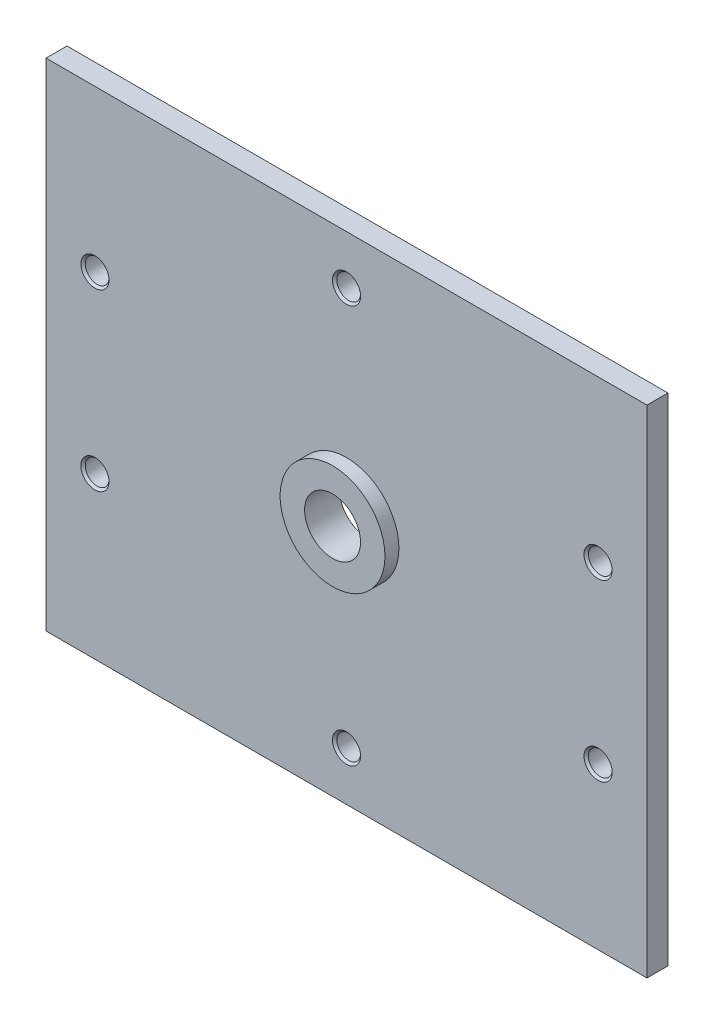
ISO-10303-21;
HEADER;
FILE_DESCRIPTION(('STEP AP214'),'2;1');
FILE_NAME('part.step','',(''),(''),'','','');
FILE_SCHEMA(('AUTOMOTIVE_DESIGN { 1 0 10303 214 1 1 1 1 }'));
ENDSEC;
DATA;
#1=APPLICATION_CONTEXT('core data for automotive mechanical design processes');
#2=APPLICATION_PROTOCOL_DEFINITION('international standard','automotive_design',2000,#1);
#3=PRODUCT_CONTEXT('',#1,'mechanical');
#4=PRODUCT('Part','Part','',(#3));
#5=PRODUCT_RELATED_PRODUCT_CATEGORY('part','',(#4));
#6=PRODUCT_DEFINITION_FORMATION('','',#4);
#7=PRODUCT_DEFINITION_CONTEXT('part definition',#1,'design');
#8=PRODUCT_DEFINITION('design','',#6,#7);
#9=PRODUCT_DEFINITION_SHAPE('','',#8);
#10=(LENGTH_UNIT() NAMED_UNIT(*) SI_UNIT(.MILLI.,.METRE.));
#11=(NAMED_UNIT(*) PLANE_ANGLE_UNIT() SI_UNIT($,.RADIAN.));
#12=(NAMED_UNIT(*) SI_UNIT($,.STERADIAN.) SOLID_ANGLE_UNIT());
#13=UNCERTAINTY_MEASURE_WITH_UNIT(LENGTH_MEASURE(1.E-05),#10,'distance_accuracy_value','');
#14=(GEOMETRIC_REPRESENTATION_CONTEXT(3) GLOBAL_UNCERTAINTY_ASSIGNED_CONTEXT((#13)) GLOBAL_UNIT_ASSIGNED_CONTEXT((#10,
#11,#12)) REPRESENTATION_CONTEXT('',''));
#15=CARTESIAN_POINT('',(0.,0.,0.));
#16=DIRECTION('',(0.,0.,1.));
#17=DIRECTION('',(1.,0.,0.));
#18=AXIS2_PLACEMENT_3D('',#15,#16,#17);
#19=CARTESIAN_POINT('',(0.,0.,6.));
#20=DIRECTION('',(1.,0.,0.));
#21=DIRECTION('',(0.,1.,0.));
#22=AXIS2_PLACEMENT_3D('',#19,#20,#21);
#23=PLANE('',#22);
#24=DIRECTION('',(0.,-1.,0.));
#25=VECTOR('',#24,1.);
#26=CARTESIAN_POINT('',(0.,0.,0.));
#27=LINE('',#26,#25);
#28=CARTESIAN_POINT('',(0.,0.,0.));
#29=VERTEX_POINT('',#28);
#30=CARTESIAN_POINT('',(0.,-142.,0.));
#31=VERTEX_POINT('',#30);
#32=EDGE_CURVE('E109',#29,#31,#27,.T.);
#33=ORIENTED_EDGE('',*,*,#32,.T.);
#34=DIRECTION('',(0.,0.,-1.));
#35=VECTOR('',#34,1.);
#36=CARTESIAN_POINT('',(0.,-142.,6.));
#37=LINE('',#36,#35);
#38=CARTESIAN_POINT('',(0.,-142.,6.));
#39=VERTEX_POINT('',#38);
#40=EDGE_CURVE('E11',#39,#31,#37,.T.);
#41=ORIENTED_EDGE('',*,*,#40,.F.);
#42=DIRECTION('',(0.,-1.,0.));
#43=VECTOR('',#42,1.);
#44=CARTESIAN_POINT('',(0.,0.,6.));
#45=LINE('',#44,#43);
#46=CARTESIAN_POINT('',(0.,0.,6.));
#47=VERTEX_POINT('',#46);
#48=EDGE_CURVE('E96',#47,#39,#45,.T.);
#49=ORIENTED_EDGE('',*,*,#48,.F.);
#50=DIRECTION('',(0.,0.,-1.));
#51=VECTOR('',#50,1.);
#52=CARTESIAN_POINT('',(0.,0.,6.));
#53=LINE('',#52,#51);
#54=EDGE_CURVE('E106',#47,#29,#53,.T.);
#55=ORIENTED_EDGE('',*,*,#54,.T.);
#56=EDGE_LOOP('',(#33,#41,#49,#55));
#57=FACE_BOUND('',#56,.T.);
#58=ADVANCED_FACE('F50',(#57),#23,.F.);
#59=CARTESIAN_POINT('',(0.,-142.,6.));
#60=DIRECTION('',(0.,1.,0.));
#61=DIRECTION('',(0.,0.,1.));
#62=AXIS2_PLACEMENT_3D('',#59,#60,#61);
#63=PLANE('',#62);
#64=DIRECTION('',(1.,0.,0.));
#65=VECTOR('',#64,1.);
#66=CARTESIAN_POINT('',(0.,-142.,0.));
#67=LINE('',#66,#65);
#68=CARTESIAN_POINT('',(172.,-142.,0.));
#69=VERTEX_POINT('',#68);
#70=EDGE_CURVE('E105',#31,#69,#67,.T.);
#71=ORIENTED_EDGE('',*,*,#70,.T.);
#72=DIRECTION('',(0.,0.,-1.));
#73=VECTOR('',#72,1.);
#74=CARTESIAN_POINT('',(172.,-142.,6.));
#75=LINE('',#74,#73);
#76=CARTESIAN_POINT('',(172.,-142.,6.));
#77=VERTEX_POINT('',#76);
#78=EDGE_CURVE('E54',#77,#69,#75,.T.);
#79=ORIENTED_EDGE('',*,*,#78,.F.);
#80=DIRECTION('',(1.,0.,0.));
#81=VECTOR('',#80,1.);
#82=CARTESIAN_POINT('',(0.,-142.,6.));
#83=LINE('',#82,#81);
#84=EDGE_CURVE('E91',#39,#77,#83,.T.);
#85=ORIENTED_EDGE('',*,*,#84,.F.);
#86=ORIENTED_EDGE('',*,*,#40,.T.);
#87=EDGE_LOOP('',(#71,#79,#85,#86));
#88=FACE_BOUND('',#87,.T.);
#89=ADVANCED_FACE('F103',(#88),#63,.F.);
#90=CARTESIAN_POINT('',(172.,0.,6.));
#91=DIRECTION('',(-1.,0.,0.));
#92=DIRECTION('',(0.,-1.,0.));
#93=AXIS2_PLACEMENT_3D('',#90,#91,#92);
#94=PLANE('',#93);
#95=DIRECTION('',(0.,1.,0.));
#96=VECTOR('',#95,1.);
#97=CARTESIAN_POINT('',(172.,0.,0.));
#98=LINE('',#97,#96);
#99=CARTESIAN_POINT('',(172.,0.,0.));
#100=VERTEX_POINT('',#99);
#101=EDGE_CURVE('E78',#69,#100,#98,.T.);
#102=ORIENTED_EDGE('',*,*,#101,.T.);
#103=DIRECTION('',(0.,0.,-1.));
#104=VECTOR('',#103,1.);
#105=CARTESIAN_POINT('',(172.,0.,6.));
#106=LINE('',#105,#104);
#107=CARTESIAN_POINT('',(172.,0.,6.));
#108=VERTEX_POINT('',#107);
#109=EDGE_CURVE('E101',#108,#100,#106,.T.);
#110=ORIENTED_EDGE('',*,*,#109,.F.);
#111=DIRECTION('',(0.,1.,0.));
#112=VECTOR('',#111,1.);
#113=CARTESIAN_POINT('',(172.,0.,6.));
#114=LINE('',#113,#112);
#115=EDGE_CURVE('E98',#77,#108,#114,.T.);
#116=ORIENTED_EDGE('',*,*,#115,.F.);
#117=ORIENTED_EDGE('',*,*,#78,.T.);
#118=EDGE_LOOP('',(#102,#110,#116,#117));
#119=FACE_BOUND('',#118,.T.);
#120=ADVANCED_FACE('F104',(#119),#94,.F.);
#121=CARTESIAN_POINT('',(0.,0.,6.));
#122=DIRECTION('',(0.,-1.,0.));
#123=DIRECTION('',(0.,0.,-1.));
#124=AXIS2_PLACEMENT_3D('',#121,#122,#123);
#125=PLANE('',#124);
#126=DIRECTION('',(-1.,0.,0.));
#127=VECTOR('',#126,1.);
#128=CARTESIAN_POINT('',(0.,0.,0.));
#129=LINE('',#128,#127);
#130=EDGE_CURVE('E88',#100,#29,#129,.T.);
#131=ORIENTED_EDGE('',*,*,#130,.T.);
#132=ORIENTED_EDGE('',*,*,#54,.F.);
#133=DIRECTION('',(-1.,0.,0.));
#134=VECTOR('',#133,1.);
#135=CARTESIAN_POINT('',(0.,0.,6.));
#136=LINE('',#135,#134);
#137=EDGE_CURVE('E61',#108,#47,#136,.T.);
#138=ORIENTED_EDGE('',*,*,#137,.F.);
#139=ORIENTED_EDGE('',*,*,#109,.T.);
#140=EDGE_LOOP('',(#131,#132,#138,#139));
#141=FACE_BOUND('',#140,.T.);
#142=ADVANCED_FACE('F117',(#141),#125,.F.);
#143=CARTESIAN_POINT('',(0.,0.,6.));
#144=DIRECTION('',(0.,0.,1.));
#145=DIRECTION('',(1.,0.,0.));
#146=AXIS2_PLACEMENT_3D('',#143,#144,#145);
#147=PLANE('',#146);
#148=CARTESIAN_POINT('',(86.,-71.,6.));
#149=DIRECTION('',(0.,0.,1.));
#150=DIRECTION('',(1.,0.,0.));
#151=AXIS2_PLACEMENT_3D('',#148,#149,#150);
#152=CIRCLE('',#151,15.);
#153=CARTESIAN_POINT('',(101.,-71.,6.));
#154=VERTEX_POINT('',#153);
#155=EDGE_CURVE('E178',#154,#154,#152,.T.);
#156=ORIENTED_EDGE('',*,*,#155,.F.);
#157=EDGE_LOOP('',(#156));
#158=FACE_BOUND('',#157,.T.);
#159=CARTESIAN_POINT('',(14.,-46.,6.));
#160=DIRECTION('',(0.,0.,1.));
#161=DIRECTION('',(1.,0.,0.));
#162=AXIS2_PLACEMENT_3D('',#159,#160,#161);
#163=CIRCLE('',#162,4.025);
#164=CARTESIAN_POINT('',(18.025,-46.,6.));
#165=VERTEX_POINT('',#164);
#166=EDGE_CURVE('E175',#165,#165,#163,.T.);
#167=ORIENTED_EDGE('',*,*,#166,.F.);
#168=EDGE_LOOP('',(#167));
#169=FACE_BOUND('',#168,.T.);
#170=CARTESIAN_POINT('',(14.,-96.,6.));
#171=DIRECTION('',(0.,0.,1.));
#172=DIRECTION('',(1.,0.,0.));
#173=AXIS2_PLACEMENT_3D('',#170,#171,#172);
#174=CIRCLE('',#173,4.025);
#175=CARTESIAN_POINT('',(18.025,-96.,6.));
#176=VERTEX_POINT('',#175);
#177=EDGE_CURVE('E161',#176,#176,#174,.T.);
#178=ORIENTED_EDGE('',*,*,#177,.F.);
#179=EDGE_LOOP('',(#178));
#180=FACE_BOUND('',#179,.T.);
#181=CARTESIAN_POINT('',(86.,-14.,6.));
#182=DIRECTION('',(0.,0.,1.));
#183=DIRECTION('',(1.,0.,0.));
#184=AXIS2_PLACEMENT_3D('',#181,#182,#183);
#185=CIRCLE('',#184,4.025);
#186=CARTESIAN_POINT('',(90.025,-14.,6.));
#187=VERTEX_POINT('',#186);
#188=EDGE_CURVE('E152',#187,#187,#185,.T.);
#189=ORIENTED_EDGE('',*,*,#188,.F.);
#190=EDGE_LOOP('',(#189));
#191=FACE_BOUND('',#190,.T.);
#192=CARTESIAN_POINT('',(86.,-128.,6.));
#193=DIRECTION('',(0.,0.,1.));
#194=DIRECTION('',(1.,0.,0.));
#195=AXIS2_PLACEMENT_3D('',#192,#193,#194);
#196=CIRCLE('',#195,4.025);
#197=CARTESIAN_POINT('',(90.025,-128.,6.));
#198=VERTEX_POINT('',#197);
#199=EDGE_CURVE('E143',#198,#198,#196,.T.);
#200=ORIENTED_EDGE('',*,*,#199,.F.);
#201=EDGE_LOOP('',(#200));
#202=FACE_BOUND('',#201,.T.);
#203=CARTESIAN_POINT('',(158.,-96.,6.));
#204=DIRECTION('',(0.,0.,1.));
#205=DIRECTION('',(1.,0.,0.));
#206=AXIS2_PLACEMENT_3D('',#203,#204,#205);
#207=CIRCLE('',#206,4.025);
#208=CARTESIAN_POINT('',(162.025,-96.,6.));
#209=VERTEX_POINT('',#208);
#210=EDGE_CURVE('E138',#209,#209,#207,.T.);
#211=ORIENTED_EDGE('',*,*,#210,.F.);
#212=EDGE_LOOP('',(#211));
#213=FACE_BOUND('',#212,.T.);
#214=CARTESIAN_POINT('',(158.,-46.,6.));
#215=DIRECTION('',(0.,0.,1.));
#216=DIRECTION('',(1.,0.,0.));
#217=AXIS2_PLACEMENT_3D('',#214,#215,#216);
#218=CIRCLE('',#217,4.025);
#219=CARTESIAN_POINT('',(162.025,-46.,6.));
#220=VERTEX_POINT('',#219);
#221=EDGE_CURVE('E130',#220,#220,#218,.T.);
#222=ORIENTED_EDGE('',*,*,#221,.F.);
#223=EDGE_LOOP('',(#222));
#224=FACE_BOUND('',#223,.T.);
#225=ORIENTED_EDGE('',*,*,#48,.T.);
#226=ORIENTED_EDGE('',*,*,#84,.T.);
#227=ORIENTED_EDGE('',*,*,#115,.T.);
#228=ORIENTED_EDGE('',*,*,#137,.T.);
#229=EDGE_LOOP('',(#225,#226,#227,#228));
#230=FACE_BOUND('',#229,.T.);
#231=ADVANCED_FACE('F92',(#158,#169,#180,#191,#202,#213,#224,#230),#147,.T.);
#232=CARTESIAN_POINT('',(0.,0.,0.));
#233=DIRECTION('',(0.,0.,1.));
#234=DIRECTION('',(1.,0.,0.));
#235=AXIS2_PLACEMENT_3D('',#232,#233,#234);
#236=PLANE('',#235);
#237=CARTESIAN_POINT('',(86.,-71.,0.));
#238=DIRECTION('',(0.,0.,1.));
#239=DIRECTION('',(1.,0.,0.));
#240=AXIS2_PLACEMENT_3D('',#237,#238,#239);
#241=CIRCLE('',#240,7.99999999999999);
#242=CARTESIAN_POINT('',(94.,-71.,0.));
#243=VERTEX_POINT('',#242);
#244=EDGE_CURVE('E181',#243,#243,#241,.T.);
#245=ORIENTED_EDGE('',*,*,#244,.T.);
#246=EDGE_LOOP('',(#245));
#247=FACE_BOUND('',#246,.T.);
#248=CARTESIAN_POINT('',(14.,-46.,0.));
#249=DIRECTION('',(0.,0.,1.));
#250=DIRECTION('',(1.,0.,0.));
#251=AXIS2_PLACEMENT_3D('',#248,#249,#250);
#252=CIRCLE('',#251,3.4);
#253=CARTESIAN_POINT('',(17.4,-46.,0.));
#254=VERTEX_POINT('',#253);
#255=EDGE_CURVE('E168',#254,#254,#252,.F.);
#256=ORIENTED_EDGE('',*,*,#255,.F.);
#257=EDGE_LOOP('',(#256));
#258=FACE_BOUND('',#257,.T.);
#259=CARTESIAN_POINT('',(14.,-96.,0.));
#260=DIRECTION('',(0.,0.,1.));
#261=DIRECTION('',(1.,0.,0.));
#262=AXIS2_PLACEMENT_3D('',#259,#260,#261);
#263=CIRCLE('',#262,3.4);
#264=CARTESIAN_POINT('',(17.4,-96.,0.));
#265=VERTEX_POINT('',#264);
#266=EDGE_CURVE('E160',#265,#265,#263,.F.);
#267=ORIENTED_EDGE('',*,*,#266,.F.);
#268=EDGE_LOOP('',(#267));
#269=FACE_BOUND('',#268,.T.);
#270=CARTESIAN_POINT('',(86.,-14.,0.));
#271=DIRECTION('',(0.,0.,1.));
#272=DIRECTION('',(1.,0.,0.));
#273=AXIS2_PLACEMENT_3D('',#270,#271,#272);
#274=CIRCLE('',#273,3.4);
#275=CARTESIAN_POINT('',(89.4,-14.,0.));
#276=VERTEX_POINT('',#275);
#277=EDGE_CURVE('E146',#276,#276,#274,.F.);
#278=ORIENTED_EDGE('',*,*,#277,.F.);
#279=EDGE_LOOP('',(#278));
#280=FACE_BOUND('',#279,.T.);
#281=CARTESIAN_POINT('',(86.,-128.,0.));
#282=DIRECTION('',(0.,0.,1.));
#283=DIRECTION('',(1.,0.,0.));
#284=AXIS2_PLACEMENT_3D('',#281,#282,#283);
#285=CIRCLE('',#284,3.4);
#286=CARTESIAN_POINT('',(89.4,-128.,0.));
#287=VERTEX_POINT('',#286);
#288=EDGE_CURVE('E137',#287,#287,#285,.F.);
#289=ORIENTED_EDGE('',*,*,#288,.F.);
#290=EDGE_LOOP('',(#289));
#291=FACE_BOUND('',#290,.T.);
#292=CARTESIAN_POINT('',(158.,-96.,0.));
#293=DIRECTION('',(0.,0.,1.));
#294=DIRECTION('',(1.,0.,0.));
#295=AXIS2_PLACEMENT_3D('',#292,#293,#294);
#296=CIRCLE('',#295,3.39999999999999);
#297=CARTESIAN_POINT('',(161.4,-96.,0.));
#298=VERTEX_POINT('',#297);
#299=EDGE_CURVE('E127',#298,#298,#296,.F.);
#300=ORIENTED_EDGE('',*,*,#299,.F.);
#301=EDGE_LOOP('',(#300));
#302=FACE_BOUND('',#301,.T.);
#303=CARTESIAN_POINT('',(158.,-46.,0.));
#304=DIRECTION('',(0.,0.,1.));
#305=DIRECTION('',(1.,0.,0.));
#306=AXIS2_PLACEMENT_3D('',#303,#304,#305);
#307=CIRCLE('',#306,3.39999999999999);
#308=CARTESIAN_POINT('',(161.4,-46.,0.));
#309=VERTEX_POINT('',#308);
#310=EDGE_CURVE('E113',#309,#309,#307,.F.);
#311=ORIENTED_EDGE('',*,*,#310,.F.);
#312=EDGE_LOOP('',(#311));
#313=FACE_BOUND('',#312,.T.);
#314=ORIENTED_EDGE('',*,*,#32,.F.);
#315=ORIENTED_EDGE('',*,*,#130,.F.);
#316=ORIENTED_EDGE('',*,*,#101,.F.);
#317=ORIENTED_EDGE('',*,*,#70,.F.);
#318=EDGE_LOOP('',(#314,#315,#316,#317));
#319=FACE_BOUND('',#318,.T.);
#320=ADVANCED_FACE('F122',(#247,#258,#269,#280,#291,#302,#313,#319),#236,.F.);
#321=CARTESIAN_POINT('',(158.,-46.,6.));
#322=DIRECTION('',(0.,0.,1.));
#323=DIRECTION('',(1.,0.,0.));
#324=AXIS2_PLACEMENT_3D('',#321,#322,#323);
#325=CYLINDRICAL_SURFACE('',#324,3.39999999999999);
#326=ORIENTED_EDGE('',*,*,#310,.T.);
#327=EDGE_LOOP('',(#326));
#328=FACE_BOUND('',#327,.T.);
#329=CARTESIAN_POINT('',(158.,-46.,5.375));
#330=DIRECTION('',(0.,0.,1.));
#331=DIRECTION('',(1.,0.,0.));
#332=AXIS2_PLACEMENT_3D('',#329,#330,#331);
#333=CIRCLE('',#332,3.39999999999999);
#334=CARTESIAN_POINT('',(161.4,-46.,5.375));
#335=VERTEX_POINT('',#334);
#336=EDGE_CURVE('E121',#335,#335,#333,.T.);
#337=ORIENTED_EDGE('',*,*,#336,.T.);
#338=EDGE_LOOP('',(#337));
#339=FACE_BOUND('',#338,.T.);
#340=ADVANCED_FACE('F230',(#328,#339),#325,.F.);
#341=CARTESIAN_POINT('',(158.,-46.,6.));
#342=DIRECTION('',(0.,0.,1.));
#343=DIRECTION('',(1.,0.,0.));
#344=AXIS2_PLACEMENT_3D('',#341,#342,#343);
#345=CONICAL_SURFACE('',#344,4.025,0.785398163397457);
#346=ORIENTED_EDGE('',*,*,#336,.F.);
#347=EDGE_LOOP('',(#346));
#348=FACE_BOUND('',#347,.T.);
#349=ORIENTED_EDGE('',*,*,#221,.T.);
#350=EDGE_LOOP('',(#349));
#351=FACE_BOUND('',#350,.T.);
#352=ADVANCED_FACE('F228',(#348,#351),#345,.F.);
#353=CARTESIAN_POINT('',(158.,-96.,6.));
#354=DIRECTION('',(0.,0.,1.));
#355=DIRECTION('',(1.,0.,0.));
#356=AXIS2_PLACEMENT_3D('',#353,#354,#355);
#357=CYLINDRICAL_SURFACE('',#356,3.39999999999999);
#358=ORIENTED_EDGE('',*,*,#299,.T.);
#359=EDGE_LOOP('',(#358));
#360=FACE_BOUND('',#359,.T.);
#361=CARTESIAN_POINT('',(158.,-96.,5.375));
#362=DIRECTION('',(0.,0.,1.));
#363=DIRECTION('',(1.,0.,0.));
#364=AXIS2_PLACEMENT_3D('',#361,#362,#363);
#365=CIRCLE('',#364,3.39999999999999);
#366=CARTESIAN_POINT('',(161.4,-96.,5.375));
#367=VERTEX_POINT('',#366);
#368=EDGE_CURVE('E131',#367,#367,#365,.T.);
#369=ORIENTED_EDGE('',*,*,#368,.T.);
#370=EDGE_LOOP('',(#369));
#371=FACE_BOUND('',#370,.T.);
#372=ADVANCED_FACE('F226',(#360,#371),#357,.F.);
#373=CARTESIAN_POINT('',(158.,-96.,6.));
#374=DIRECTION('',(0.,0.,1.));
#375=DIRECTION('',(1.,0.,0.));
#376=AXIS2_PLACEMENT_3D('',#373,#374,#375);
#377=CONICAL_SURFACE('',#376,4.025,0.785398163397457);
#378=ORIENTED_EDGE('',*,*,#368,.F.);
#379=EDGE_LOOP('',(#378));
#380=FACE_BOUND('',#379,.T.);
#381=ORIENTED_EDGE('',*,*,#210,.T.);
#382=EDGE_LOOP('',(#381));
#383=FACE_BOUND('',#382,.T.);
#384=ADVANCED_FACE('F240',(#380,#383),#377,.F.);
#385=CARTESIAN_POINT('',(86.,-128.,6.));
#386=DIRECTION('',(0.,0.,1.));
#387=DIRECTION('',(1.,0.,0.));
#388=AXIS2_PLACEMENT_3D('',#385,#386,#387);
#389=CYLINDRICAL_SURFACE('',#388,3.4);
#390=ORIENTED_EDGE('',*,*,#288,.T.);
#391=EDGE_LOOP('',(#390));
#392=FACE_BOUND('',#391,.T.);
#393=CARTESIAN_POINT('',(86.,-128.,5.375));
#394=DIRECTION('',(0.,0.,1.));
#395=DIRECTION('',(1.,0.,0.));
#396=AXIS2_PLACEMENT_3D('',#393,#394,#395);
#397=CIRCLE('',#396,3.4);
#398=CARTESIAN_POINT('',(89.4,-128.,5.375));
#399=VERTEX_POINT('',#398);
#400=EDGE_CURVE('E145',#399,#399,#397,.T.);
#401=ORIENTED_EDGE('',*,*,#400,.T.);
#402=EDGE_LOOP('',(#401));
#403=FACE_BOUND('',#402,.T.);
#404=ADVANCED_FACE('F341',(#392,#403),#389,.F.);
#405=CARTESIAN_POINT('',(86.,-128.,6.));
#406=DIRECTION('',(0.,0.,1.));
#407=DIRECTION('',(1.,0.,0.));
#408=AXIS2_PLACEMENT_3D('',#405,#406,#407);
#409=CONICAL_SURFACE('',#408,4.025,0.785398163397446);
#410=ORIENTED_EDGE('',*,*,#400,.F.);
#411=EDGE_LOOP('',(#410));
#412=FACE_BOUND('',#411,.T.);
#413=ORIENTED_EDGE('',*,*,#199,.T.);
#414=EDGE_LOOP('',(#413));
#415=FACE_BOUND('',#414,.T.);
#416=ADVANCED_FACE('F331',(#412,#415),#409,.F.);
#417=CARTESIAN_POINT('',(86.,-14.,6.));
#418=DIRECTION('',(0.,0.,1.));
#419=DIRECTION('',(1.,0.,0.));
#420=AXIS2_PLACEMENT_3D('',#417,#418,#419);
#421=CYLINDRICAL_SURFACE('',#420,3.4);
#422=ORIENTED_EDGE('',*,*,#277,.T.);
#423=EDGE_LOOP('',(#422));
#424=FACE_BOUND('',#423,.T.);
#425=CARTESIAN_POINT('',(86.,-14.,5.375));
#426=DIRECTION('',(0.,0.,1.));
#427=DIRECTION('',(1.,0.,0.));
#428=AXIS2_PLACEMENT_3D('',#425,#426,#427);
#429=CIRCLE('',#428,3.4);
#430=CARTESIAN_POINT('',(89.4,-14.,5.375));
#431=VERTEX_POINT('',#430);
#432=EDGE_CURVE('E153',#431,#431,#429,.T.);
#433=ORIENTED_EDGE('',*,*,#432,.T.);
#434=EDGE_LOOP('',(#433));
#435=FACE_BOUND('',#434,.T.);
#436=ADVANCED_FACE('F324',(#424,#435),#421,.F.);
#437=CARTESIAN_POINT('',(86.,-14.,6.));
#438=DIRECTION('',(0.,0.,1.));
#439=DIRECTION('',(1.,0.,0.));
#440=AXIS2_PLACEMENT_3D('',#437,#438,#439);
#441=CONICAL_SURFACE('',#440,4.025,0.785398163397446);
#442=ORIENTED_EDGE('',*,*,#432,.F.);
#443=EDGE_LOOP('',(#442));
#444=FACE_BOUND('',#443,.T.);
#445=ORIENTED_EDGE('',*,*,#188,.T.);
#446=EDGE_LOOP('',(#445));
#447=FACE_BOUND('',#446,.T.);
#448=ADVANCED_FACE('F313',(#444,#447),#441,.F.);
#449=CARTESIAN_POINT('',(14.,-96.,6.));
#450=DIRECTION('',(0.,0.,1.));
#451=DIRECTION('',(1.,0.,0.));
#452=AXIS2_PLACEMENT_3D('',#449,#450,#451);
#453=CYLINDRICAL_SURFACE('',#452,3.4);
#454=ORIENTED_EDGE('',*,*,#266,.T.);
#455=EDGE_LOOP('',(#454));
#456=FACE_BOUND('',#455,.T.);
#457=CARTESIAN_POINT('',(14.,-96.,5.375));
#458=DIRECTION('',(0.,0.,1.));
#459=DIRECTION('',(1.,0.,0.));
#460=AXIS2_PLACEMENT_3D('',#457,#458,#459);
#461=CIRCLE('',#460,3.4);
#462=CARTESIAN_POINT('',(17.4,-96.,5.375));
#463=VERTEX_POINT('',#462);
#464=EDGE_CURVE('E159',#463,#463,#461,.T.);
#465=ORIENTED_EDGE('',*,*,#464,.T.);
#466=EDGE_LOOP('',(#465));
#467=FACE_BOUND('',#466,.T.);
#468=ADVANCED_FACE('F304',(#456,#467),#453,.F.);
#469=CARTESIAN_POINT('',(14.,-96.,6.));
#470=DIRECTION('',(0.,0.,1.));
#471=DIRECTION('',(1.,0.,0.));
#472=AXIS2_PLACEMENT_3D('',#469,#470,#471);
#473=CONICAL_SURFACE('',#472,4.025,0.785398163397448);
#474=ORIENTED_EDGE('',*,*,#464,.F.);
#475=EDGE_LOOP('',(#474));
#476=FACE_BOUND('',#475,.T.);
#477=ORIENTED_EDGE('',*,*,#177,.T.);
#478=EDGE_LOOP('',(#477));
#479=FACE_BOUND('',#478,.T.);
#480=ADVANCED_FACE('F294',(#476,#479),#473,.F.);
#481=CARTESIAN_POINT('',(14.,-46.,6.));
#482=DIRECTION('',(0.,0.,1.));
#483=DIRECTION('',(1.,0.,0.));
#484=AXIS2_PLACEMENT_3D('',#481,#482,#483);
#485=CYLINDRICAL_SURFACE('',#484,3.4);
#486=ORIENTED_EDGE('',*,*,#255,.T.);
#487=EDGE_LOOP('',(#486));
#488=FACE_BOUND('',#487,.T.);
#489=CARTESIAN_POINT('',(14.,-46.,5.375));
#490=DIRECTION('',(0.,0.,1.));
#491=DIRECTION('',(1.,0.,0.));
#492=AXIS2_PLACEMENT_3D('',#489,#490,#491);
#493=CIRCLE('',#492,3.4);
#494=CARTESIAN_POINT('',(17.4,-46.,5.375));
#495=VERTEX_POINT('',#494);
#496=EDGE_CURVE('E169',#495,#495,#493,.T.);
#497=ORIENTED_EDGE('',*,*,#496,.T.);
#498=EDGE_LOOP('',(#497));
#499=FACE_BOUND('',#498,.T.);
#500=ADVANCED_FACE('F288',(#488,#499),#485,.F.);
#501=CARTESIAN_POINT('',(14.,-46.,6.));
#502=DIRECTION('',(0.,0.,1.));
#503=DIRECTION('',(1.,0.,0.));
#504=AXIS2_PLACEMENT_3D('',#501,#502,#503);
#505=CONICAL_SURFACE('',#504,4.025,0.785398163397448);
#506=ORIENTED_EDGE('',*,*,#496,.F.);
#507=EDGE_LOOP('',(#506));
#508=FACE_BOUND('',#507,.T.);
#509=ORIENTED_EDGE('',*,*,#166,.T.);
#510=EDGE_LOOP('',(#509));
#511=FACE_BOUND('',#510,.T.);
#512=ADVANCED_FACE('F210',(#508,#511),#505,.F.);
#513=CARTESIAN_POINT('',(86.,-71.,10.));
#514=DIRECTION('',(0.,0.,-1.));
#515=DIRECTION('',(-1.,0.,0.));
#516=AXIS2_PLACEMENT_3D('',#513,#514,#515);
#517=CYLINDRICAL_SURFACE('',#516,15.);
#518=CARTESIAN_POINT('',(86.,-71.,10.));
#519=DIRECTION('',(0.,0.,1.));
#520=DIRECTION('',(1.,0.,0.));
#521=AXIS2_PLACEMENT_3D('',#518,#519,#520);
#522=CIRCLE('',#521,15.);
#523=CARTESIAN_POINT('',(101.,-71.,10.));
#524=VERTEX_POINT('',#523);
#525=EDGE_CURVE('E174',#524,#524,#522,.T.);
#526=ORIENTED_EDGE('',*,*,#525,.F.);
#527=EDGE_LOOP('',(#526));
#528=FACE_BOUND('',#527,.T.);
#529=ORIENTED_EDGE('',*,*,#155,.T.);
#530=EDGE_LOOP('',(#529));
#531=FACE_BOUND('',#530,.T.);
#532=ADVANCED_FACE('F203',(#528,#531),#517,.T.);
#533=CARTESIAN_POINT('',(0.,0.,10.));
#534=DIRECTION('',(0.,0.,1.));
#535=DIRECTION('',(1.,0.,0.));
#536=AXIS2_PLACEMENT_3D('',#533,#534,#535);
#537=PLANE('',#536);
#538=CARTESIAN_POINT('',(86.,-71.,10.));
#539=DIRECTION('',(0.,0.,1.));
#540=DIRECTION('',(1.,0.,0.));
#541=AXIS2_PLACEMENT_3D('',#538,#539,#540);
#542=CIRCLE('',#541,7.99999999999999);
#543=CARTESIAN_POINT('',(94.,-71.,10.));
#544=VERTEX_POINT('',#543);
#545=EDGE_CURVE('E183',#544,#544,#542,.T.);
#546=ORIENTED_EDGE('',*,*,#545,.F.);
#547=EDGE_LOOP('',(#546));
#548=FACE_BOUND('',#547,.T.);
#549=ORIENTED_EDGE('',*,*,#525,.T.);
#550=EDGE_LOOP('',(#549));
#551=FACE_BOUND('',#550,.T.);
#552=ADVANCED_FACE('F192',(#548,#551),#537,.T.);
#553=CARTESIAN_POINT('',(86.,-71.,0.));
#554=DIRECTION('',(0.,0.,1.));
#555=DIRECTION('',(1.,0.,0.));
#556=AXIS2_PLACEMENT_3D('',#553,#554,#555);
#557=CYLINDRICAL_SURFACE('',#556,7.99999999999999);
#558=ORIENTED_EDGE('',*,*,#244,.F.);
#559=EDGE_LOOP('',(#558));
#560=FACE_BOUND('',#559,.T.);
#561=ORIENTED_EDGE('',*,*,#545,.T.);
#562=EDGE_LOOP('',(#561));
#563=FACE_BOUND('',#562,.T.);
#564=ADVANCED_FACE('F195',(#560,#563),#557,.F.);
#565=CLOSED_SHELL('',(#58,#89,#120,#142,#231,#320,#340,#352,#372,#384,#404,#416,#436,#448,#468,
#480,#500,#512,#532,#552,#564));
#566=MANIFOLD_SOLID_BREP('B2',#565);
#567=ADVANCED_BREP_SHAPE_REPRESENTATION('',(#18,#566),#14);
#568=SHAPE_DEFINITION_REPRESENTATION(#9,#567);
ENDSEC;
END-ISO-10303-21;
